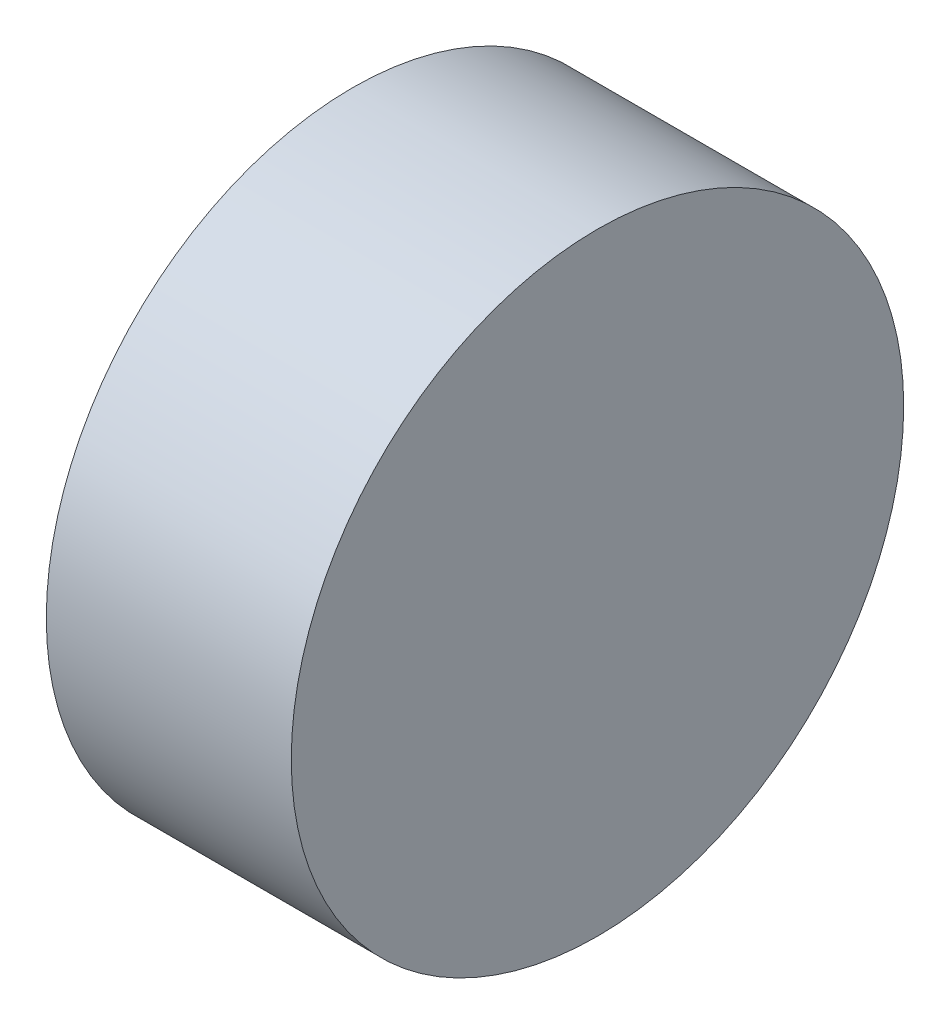
ISO-10303-21;
HEADER;
FILE_DESCRIPTION(('STEP AP214'),'2;1');
FILE_NAME('part.step','',(''),(''),'','','');
FILE_SCHEMA(('AUTOMOTIVE_DESIGN { 1 0 10303 214 1 1 1 1 }'));
ENDSEC;
DATA;
#1=APPLICATION_CONTEXT('core data for automotive mechanical design processes');
#2=APPLICATION_PROTOCOL_DEFINITION('international standard','automotive_design',2000,#1);
#3=PRODUCT_CONTEXT('',#1,'mechanical');
#4=PRODUCT('Part','Part','',(#3));
#5=PRODUCT_RELATED_PRODUCT_CATEGORY('part','',(#4));
#6=PRODUCT_DEFINITION_FORMATION('','',#4);
#7=PRODUCT_DEFINITION_CONTEXT('part definition',#1,'design');
#8=PRODUCT_DEFINITION('design','',#6,#7);
#9=PRODUCT_DEFINITION_SHAPE('','',#8);
#10=(LENGTH_UNIT() NAMED_UNIT(*) SI_UNIT(.MILLI.,.METRE.));
#11=(NAMED_UNIT(*) PLANE_ANGLE_UNIT() SI_UNIT($,.RADIAN.));
#12=(NAMED_UNIT(*) SI_UNIT($,.STERADIAN.) SOLID_ANGLE_UNIT());
#13=UNCERTAINTY_MEASURE_WITH_UNIT(LENGTH_MEASURE(1.E-05),#10,'distance_accuracy_value','');
#14=(GEOMETRIC_REPRESENTATION_CONTEXT(3) GLOBAL_UNCERTAINTY_ASSIGNED_CONTEXT((#13)) GLOBAL_UNIT_ASSIGNED_CONTEXT((#10,
#11,#12)) REPRESENTATION_CONTEXT('',''));
#15=CARTESIAN_POINT('',(0.,0.,0.));
#16=DIRECTION('',(0.,0.,1.));
#17=DIRECTION('',(1.,0.,0.));
#18=AXIS2_PLACEMENT_3D('',#15,#16,#17);
#19=CARTESIAN_POINT('',(-1000.,-2480.,0.));
#20=DIRECTION('',(1.,0.,0.));
#21=DIRECTION('',(0.,0.,-1.));
#22=AXIS2_PLACEMENT_3D('',#19,#20,#21);
#23=CYLINDRICAL_SURFACE('',#22,2500.);
#24=CARTESIAN_POINT('',(-1000.,-2480.,0.));
#25=DIRECTION('',(1.,0.,0.));
#26=DIRECTION('',(0.,0.,-1.));
#27=AXIS2_PLACEMENT_3D('',#24,#25,#26);
#28=CIRCLE('',#27,2500.);
#29=CARTESIAN_POINT('',(-1000.,-2480.,-2500.));
#30=VERTEX_POINT('',#29);
#31=EDGE_CURVE('E10',#30,#30,#28,.T.);
#32=ORIENTED_EDGE('',*,*,#31,.T.);
#33=EDGE_LOOP('',(#32));
#34=FACE_BOUND('',#33,.T.);
#35=CARTESIAN_POINT('',(1000.,-2480.,0.));
#36=DIRECTION('',(1.,0.,0.));
#37=DIRECTION('',(0.,0.,-1.));
#38=AXIS2_PLACEMENT_3D('',#35,#36,#37);
#39=CIRCLE('',#38,2500.);
#40=CARTESIAN_POINT('',(1000.,-2480.,-2500.));
#41=VERTEX_POINT('',#40);
#42=EDGE_CURVE('E43',#41,#41,#39,.T.);
#43=ORIENTED_EDGE('',*,*,#42,.F.);
#44=EDGE_LOOP('',(#43));
#45=FACE_BOUND('',#44,.T.);
#46=ADVANCED_FACE('F37',(#34,#45),#23,.T.);
#47=CARTESIAN_POINT('',(-1000.,-2480.,0.));
#48=DIRECTION('',(1.,0.,0.));
#49=DIRECTION('',(0.,0.,-1.));
#50=AXIS2_PLACEMENT_3D('',#47,#48,#49);
#51=PLANE('',#50);
#52=ORIENTED_EDGE('',*,*,#31,.F.);
#53=EDGE_LOOP('',(#52));
#54=FACE_BOUND('',#53,.T.);
#55=ADVANCED_FACE('F52',(#54),#51,.F.);
#56=CARTESIAN_POINT('',(1000.,-2480.,0.));
#57=DIRECTION('',(1.,0.,0.));
#58=DIRECTION('',(0.,0.,-1.));
#59=AXIS2_PLACEMENT_3D('',#56,#57,#58);
#60=PLANE('',#59);
#61=ORIENTED_EDGE('',*,*,#42,.T.);
#62=EDGE_LOOP('',(#61));
#63=FACE_BOUND('',#62,.T.);
#64=ADVANCED_FACE('F49',(#63),#60,.T.);
#65=CLOSED_SHELL('',(#46,#55,#64));
#66=MANIFOLD_SOLID_BREP('B2',#65);
#67=ADVANCED_BREP_SHAPE_REPRESENTATION('',(#18,#66),#14);
#68=SHAPE_DEFINITION_REPRESENTATION(#9,#67);
ENDSEC;
END-ISO-10303-21;
